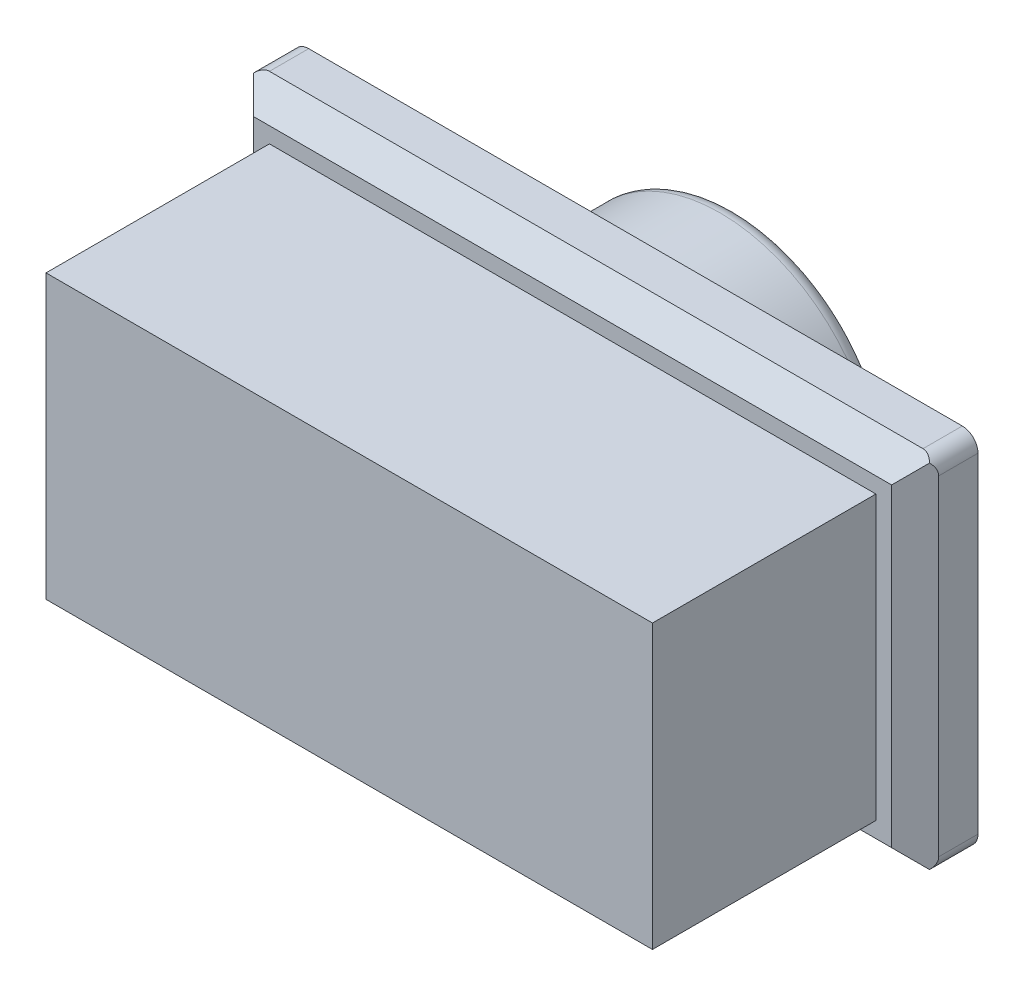
ISO-10303-21;
HEADER;
FILE_DESCRIPTION(('STEP AP214'),'2;1');
FILE_NAME('part.step','',(''),(''),'','','');
FILE_SCHEMA(('AUTOMOTIVE_DESIGN { 1 0 10303 214 1 1 1 1 }'));
ENDSEC;
DATA;
#1=APPLICATION_CONTEXT('core data for automotive mechanical design processes');
#2=APPLICATION_PROTOCOL_DEFINITION('international standard','automotive_design',2000,#1);
#3=PRODUCT_CONTEXT('',#1,'mechanical');
#4=PRODUCT('Part','Part','',(#3));
#5=PRODUCT_RELATED_PRODUCT_CATEGORY('part','',(#4));
#6=PRODUCT_DEFINITION_FORMATION('','',#4);
#7=PRODUCT_DEFINITION_CONTEXT('part definition',#1,'design');
#8=PRODUCT_DEFINITION('design','',#6,#7);
#9=PRODUCT_DEFINITION_SHAPE('','',#8);
#10=(LENGTH_UNIT() NAMED_UNIT(*) SI_UNIT(.MILLI.,.METRE.));
#11=(NAMED_UNIT(*) PLANE_ANGLE_UNIT() SI_UNIT($,.RADIAN.));
#12=(NAMED_UNIT(*) SI_UNIT($,.STERADIAN.) SOLID_ANGLE_UNIT());
#13=UNCERTAINTY_MEASURE_WITH_UNIT(LENGTH_MEASURE(1.E-05),#10,'distance_accuracy_value','');
#14=(GEOMETRIC_REPRESENTATION_CONTEXT(3) GLOBAL_UNCERTAINTY_ASSIGNED_CONTEXT((#13)) GLOBAL_UNIT_ASSIGNED_CONTEXT((#10,
#11,#12)) REPRESENTATION_CONTEXT('',''));
#15=CARTESIAN_POINT('',(0.,0.,0.));
#16=DIRECTION('',(0.,0.,1.));
#17=DIRECTION('',(1.,0.,0.));
#18=AXIS2_PLACEMENT_3D('',#15,#16,#17);
#19=CARTESIAN_POINT('',(-4.826,2.25,3.556));
#20=DIRECTION('',(1.,0.,0.));
#21=DIRECTION('',(0.,0.,-1.));
#22=AXIS2_PLACEMENT_3D('',#19,#20,#21);
#23=PLANE('',#22);
#24=DIRECTION('',(0.,-1.,0.));
#25=VECTOR('',#24,1.);
#26=CARTESIAN_POINT('',(-4.826,2.25,0.));
#27=LINE('',#26,#25);
#28=CARTESIAN_POINT('',(-4.826,2.25,0.));
#29=VERTEX_POINT('',#28);
#30=CARTESIAN_POINT('',(-4.826,-2.25,0.));
#31=VERTEX_POINT('',#30);
#32=EDGE_CURVE('E154',#29,#31,#27,.T.);
#33=ORIENTED_EDGE('',*,*,#32,.T.);
#34=DIRECTION('',(0.,0.,-1.));
#35=VECTOR('',#34,1.);
#36=CARTESIAN_POINT('',(-4.826,-2.25,3.556));
#37=LINE('',#36,#35);
#38=CARTESIAN_POINT('',(-4.826,-2.25,3.556));
#39=VERTEX_POINT('',#38);
#40=EDGE_CURVE('E176',#39,#31,#37,.T.);
#41=ORIENTED_EDGE('',*,*,#40,.F.);
#42=DIRECTION('',(0.,-1.,0.));
#43=VECTOR('',#42,1.);
#44=CARTESIAN_POINT('',(-4.826,2.25,3.556));
#45=LINE('',#44,#43);
#46=CARTESIAN_POINT('',(-4.826,2.25,3.556));
#47=VERTEX_POINT('',#46);
#48=EDGE_CURVE('E159',#47,#39,#45,.T.);
#49=ORIENTED_EDGE('',*,*,#48,.F.);
#50=DIRECTION('',(0.,0.,-1.));
#51=VECTOR('',#50,1.);
#52=CARTESIAN_POINT('',(-4.826,2.25,3.556));
#53=LINE('',#52,#51);
#54=EDGE_CURVE('E174',#47,#29,#53,.T.);
#55=ORIENTED_EDGE('',*,*,#54,.T.);
#56=EDGE_LOOP('',(#33,#41,#49,#55));
#57=FACE_BOUND('',#56,.T.);
#58=ADVANCED_FACE('F33',(#57),#23,.F.);
#59=CARTESIAN_POINT('',(-4.826,-2.25,3.556));
#60=DIRECTION('',(0.,1.,0.));
#61=DIRECTION('',(0.,0.,1.));
#62=AXIS2_PLACEMENT_3D('',#59,#60,#61);
#63=PLANE('',#62);
#64=DIRECTION('',(1.,0.,0.));
#65=VECTOR('',#64,1.);
#66=CARTESIAN_POINT('',(-4.826,-2.25,0.));
#67=LINE('',#66,#65);
#68=CARTESIAN_POINT('',(4.826,-2.25,0.));
#69=VERTEX_POINT('',#68);
#70=EDGE_CURVE('E170',#31,#69,#67,.T.);
#71=ORIENTED_EDGE('',*,*,#70,.T.);
#72=DIRECTION('',(0.,0.,-1.));
#73=VECTOR('',#72,1.);
#74=CARTESIAN_POINT('',(4.826,-2.25,3.556));
#75=LINE('',#74,#73);
#76=CARTESIAN_POINT('',(4.826,-2.25,3.556));
#77=VERTEX_POINT('',#76);
#78=EDGE_CURVE('E169',#77,#69,#75,.T.);
#79=ORIENTED_EDGE('',*,*,#78,.F.);
#80=DIRECTION('',(1.,0.,0.));
#81=VECTOR('',#80,1.);
#82=CARTESIAN_POINT('',(-4.826,-2.25,3.556));
#83=LINE('',#82,#81);
#84=EDGE_CURVE('E330',#39,#77,#83,.T.);
#85=ORIENTED_EDGE('',*,*,#84,.F.);
#86=ORIENTED_EDGE('',*,*,#40,.T.);
#87=EDGE_LOOP('',(#71,#79,#85,#86));
#88=FACE_BOUND('',#87,.T.);
#89=ADVANCED_FACE('F268',(#88),#63,.F.);
#90=CARTESIAN_POINT('',(4.826,2.25,3.556));
#91=DIRECTION('',(-1.,0.,0.));
#92=DIRECTION('',(0.,0.,1.));
#93=AXIS2_PLACEMENT_3D('',#90,#91,#92);
#94=PLANE('',#93);
#95=DIRECTION('',(0.,1.,0.));
#96=VECTOR('',#95,1.);
#97=CARTESIAN_POINT('',(4.826,2.25,0.));
#98=LINE('',#97,#96);
#99=CARTESIAN_POINT('',(4.826,2.25,0.));
#100=VERTEX_POINT('',#99);
#101=EDGE_CURVE('E151',#69,#100,#98,.T.);
#102=ORIENTED_EDGE('',*,*,#101,.T.);
#103=DIRECTION('',(0.,0.,-1.));
#104=VECTOR('',#103,1.);
#105=CARTESIAN_POINT('',(4.826,2.25,3.556));
#106=LINE('',#105,#104);
#107=CARTESIAN_POINT('',(4.826,2.25,3.556));
#108=VERTEX_POINT('',#107);
#109=EDGE_CURVE('E166',#108,#100,#106,.T.);
#110=ORIENTED_EDGE('',*,*,#109,.F.);
#111=DIRECTION('',(0.,1.,0.));
#112=VECTOR('',#111,1.);
#113=CARTESIAN_POINT('',(4.826,2.25,3.556));
#114=LINE('',#113,#112);
#115=EDGE_CURVE('E332',#77,#108,#114,.T.);
#116=ORIENTED_EDGE('',*,*,#115,.F.);
#117=ORIENTED_EDGE('',*,*,#78,.T.);
#118=EDGE_LOOP('',(#102,#110,#116,#117));
#119=FACE_BOUND('',#118,.T.);
#120=ADVANCED_FACE('F164',(#119),#94,.F.);
#121=CARTESIAN_POINT('',(-4.826,2.25,3.556));
#122=DIRECTION('',(0.,-1.,0.));
#123=DIRECTION('',(0.,0.,-1.));
#124=AXIS2_PLACEMENT_3D('',#121,#122,#123);
#125=PLANE('',#124);
#126=DIRECTION('',(-1.,0.,0.));
#127=VECTOR('',#126,1.);
#128=CARTESIAN_POINT('',(-4.826,2.25,0.));
#129=LINE('',#128,#127);
#130=EDGE_CURVE('E148',#100,#29,#129,.T.);
#131=ORIENTED_EDGE('',*,*,#130,.T.);
#132=ORIENTED_EDGE('',*,*,#54,.F.);
#133=DIRECTION('',(-1.,0.,0.));
#134=VECTOR('',#133,1.);
#135=CARTESIAN_POINT('',(-4.826,2.25,3.556));
#136=LINE('',#135,#134);
#137=EDGE_CURVE('E173',#108,#47,#136,.T.);
#138=ORIENTED_EDGE('',*,*,#137,.F.);
#139=ORIENTED_EDGE('',*,*,#109,.T.);
#140=EDGE_LOOP('',(#131,#132,#138,#139));
#141=FACE_BOUND('',#140,.T.);
#142=ADVANCED_FACE('F172',(#141),#125,.F.);
#143=CARTESIAN_POINT('',(0.,0.,3.556));
#144=DIRECTION('',(0.,0.,1.));
#145=DIRECTION('',(1.,0.,0.));
#146=AXIS2_PLACEMENT_3D('',#143,#144,#145);
#147=PLANE('',#146);
#148=ORIENTED_EDGE('',*,*,#48,.T.);
#149=ORIENTED_EDGE('',*,*,#84,.T.);
#150=ORIENTED_EDGE('',*,*,#115,.T.);
#151=ORIENTED_EDGE('',*,*,#137,.T.);
#152=EDGE_LOOP('',(#148,#149,#150,#151));
#153=FACE_BOUND('',#152,.T.);
#154=ADVANCED_FACE('F338',(#153),#147,.T.);
#155=CARTESIAN_POINT('',(0.,0.,0.));
#156=DIRECTION('',(0.,0.,-1.));
#157=DIRECTION('',(-1.,0.,0.));
#158=AXIS2_PLACEMENT_3D('',#155,#156,#157);
#159=PLANE('',#158);
#160=DIRECTION('',(0.,-1.,0.));
#161=VECTOR('',#160,1.);
#162=CARTESIAN_POINT('',(-5.0760178,0.,0.));
#163=LINE('',#162,#161);
#164=CARTESIAN_POINT('',(-5.0760178,2.5000178,0.));
#165=VERTEX_POINT('',#164);
#166=CARTESIAN_POINT('',(-5.0760178,-2.5000178,0.));
#167=VERTEX_POINT('',#166);
#168=EDGE_CURVE('E190',#165,#167,#163,.T.);
#169=ORIENTED_EDGE('',*,*,#168,.T.);
#170=DIRECTION('',(1.,0.,0.));
#171=VECTOR('',#170,1.);
#172=CARTESIAN_POINT('',(0.,-2.5000178,0.));
#173=LINE('',#172,#171);
#174=CARTESIAN_POINT('',(5.0760178,-2.5000178,0.));
#175=VERTEX_POINT('',#174);
#176=EDGE_CURVE('E192',#167,#175,#173,.T.);
#177=ORIENTED_EDGE('',*,*,#176,.T.);
#178=DIRECTION('',(0.,1.,0.));
#179=VECTOR('',#178,1.);
#180=CARTESIAN_POINT('',(5.0760178,0.,0.));
#181=LINE('',#180,#179);
#182=CARTESIAN_POINT('',(5.0760178,2.5000178,0.));
#183=VERTEX_POINT('',#182);
#184=EDGE_CURVE('E185',#175,#183,#181,.T.);
#185=ORIENTED_EDGE('',*,*,#184,.T.);
#186=DIRECTION('',(-1.,0.,0.));
#187=VECTOR('',#186,1.);
#188=CARTESIAN_POINT('',(0.,2.5000178,0.));
#189=LINE('',#188,#187);
#190=EDGE_CURVE('E188',#183,#165,#189,.T.);
#191=ORIENTED_EDGE('',*,*,#190,.T.);
#192=EDGE_LOOP('',(#169,#177,#185,#191));
#193=FACE_BOUND('',#192,.T.);
#194=ORIENTED_EDGE('',*,*,#70,.F.);
#195=ORIENTED_EDGE('',*,*,#32,.F.);
#196=ORIENTED_EDGE('',*,*,#130,.F.);
#197=ORIENTED_EDGE('',*,*,#101,.F.);
#198=EDGE_LOOP('',(#194,#195,#196,#197));
#199=FACE_BOUND('',#198,.T.);
#200=ADVANCED_FACE('F150',(#193,#199),#159,.F.);
#201=CARTESIAN_POINT('',(5.4510178,-2.8750178,-1.));
#202=DIRECTION('',(0.,1.,0.));
#203=DIRECTION('',(0.,0.,1.));
#204=AXIS2_PLACEMENT_3D('',#201,#202,#203);
#205=PLANE('',#204);
#206=DIRECTION('',(-1.,0.,0.));
#207=VECTOR('',#206,1.);
#208=CARTESIAN_POINT('',(5.4510178,-2.8750178,-0.375000000000002));
#209=LINE('',#208,#207);
#210=CARTESIAN_POINT('',(5.2010178,-2.8750178,-0.375000000000002));
#211=VERTEX_POINT('',#210);
#212=CARTESIAN_POINT('',(-5.2010178,-2.8750178,-0.375000000000002));
#213=VERTEX_POINT('',#212);
#214=EDGE_CURVE('E182',#211,#213,#209,.T.);
#215=ORIENTED_EDGE('',*,*,#214,.T.);
#216=DIRECTION('',(0.,0.,1.));
#217=VECTOR('',#216,1.);
#218=CARTESIAN_POINT('',(-5.2010178,-2.8750178,-1.));
#219=LINE('',#218,#217);
#220=CARTESIAN_POINT('',(-5.2010178,-2.8750178,-1.));
#221=VERTEX_POINT('',#220);
#222=EDGE_CURVE('E230',#213,#221,#219,.F.);
#223=ORIENTED_EDGE('',*,*,#222,.T.);
#224=DIRECTION('',(-1.,0.,0.));
#225=VECTOR('',#224,1.);
#226=CARTESIAN_POINT('',(5.4510178,-2.8750178,-1.));
#227=LINE('',#226,#225);
#228=CARTESIAN_POINT('',(5.2010178,-2.8750178,-1.));
#229=VERTEX_POINT('',#228);
#230=EDGE_CURVE('E486',#229,#221,#227,.T.);
#231=ORIENTED_EDGE('',*,*,#230,.F.);
#232=DIRECTION('',(0.,0.,1.));
#233=VECTOR('',#232,1.);
#234=CARTESIAN_POINT('',(5.2010178,-2.8750178,-1.));
#235=LINE('',#234,#233);
#236=EDGE_CURVE('E227',#229,#211,#235,.T.);
#237=ORIENTED_EDGE('',*,*,#236,.T.);
#238=EDGE_LOOP('',(#215,#223,#231,#237));
#239=FACE_BOUND('',#238,.T.);
#240=ADVANCED_FACE('F345',(#239),#205,.F.);
#241=CARTESIAN_POINT('',(-5.4510178,-2.8750178,-1.));
#242=DIRECTION('',(1.,0.,0.));
#243=DIRECTION('',(0.,0.,-1.));
#244=AXIS2_PLACEMENT_3D('',#241,#242,#243);
#245=PLANE('',#244);
#246=DIRECTION('',(0.,1.,0.));
#247=VECTOR('',#246,1.);
#248=CARTESIAN_POINT('',(-5.4510178,-2.8750178,-1.));
#249=LINE('',#248,#247);
#250=CARTESIAN_POINT('',(-5.4510178,-2.6250178,-1.));
#251=VERTEX_POINT('',#250);
#252=CARTESIAN_POINT('',(-5.4510178,2.6250178,-1.));
#253=VERTEX_POINT('',#252);
#254=EDGE_CURVE('E324',#251,#253,#249,.T.);
#255=ORIENTED_EDGE('',*,*,#254,.F.);
#256=DIRECTION('',(0.,0.,1.));
#257=VECTOR('',#256,1.);
#258=CARTESIAN_POINT('',(-5.4510178,-2.6250178,-1.));
#259=LINE('',#258,#257);
#260=CARTESIAN_POINT('',(-5.4510178,-2.6250178,-0.375000000000002));
#261=VERTEX_POINT('',#260);
#262=EDGE_CURVE('E216',#251,#261,#259,.T.);
#263=ORIENTED_EDGE('',*,*,#262,.T.);
#264=DIRECTION('',(0.,1.,0.));
#265=VECTOR('',#264,1.);
#266=CARTESIAN_POINT('',(-5.4510178,-2.8750178,-0.375000000000002));
#267=LINE('',#266,#265);
#268=CARTESIAN_POINT('',(-5.4510178,2.6250178,-0.375000000000002));
#269=VERTEX_POINT('',#268);
#270=EDGE_CURVE('E195',#261,#269,#267,.T.);
#271=ORIENTED_EDGE('',*,*,#270,.T.);
#272=DIRECTION('',(0.,0.,1.));
#273=VECTOR('',#272,1.);
#274=CARTESIAN_POINT('',(-5.4510178,2.6250178,-1.));
#275=LINE('',#274,#273);
#276=EDGE_CURVE('E203',#269,#253,#275,.F.);
#277=ORIENTED_EDGE('',*,*,#276,.T.);
#278=EDGE_LOOP('',(#255,#263,#271,#277));
#279=FACE_BOUND('',#278,.T.);
#280=ADVANCED_FACE('F376',(#279),#245,.F.);
#281=CARTESIAN_POINT('',(-5.4510178,2.8750178,-1.));
#282=DIRECTION('',(0.,-1.,0.));
#283=DIRECTION('',(0.,0.,-1.));
#284=AXIS2_PLACEMENT_3D('',#281,#282,#283);
#285=PLANE('',#284);
#286=DIRECTION('',(1.,0.,0.));
#287=VECTOR('',#286,1.);
#288=CARTESIAN_POINT('',(-5.4510178,2.8750178,-0.375000000000002));
#289=LINE('',#288,#287);
#290=CARTESIAN_POINT('',(-5.2010178,2.8750178,-0.375000000000002));
#291=VERTEX_POINT('',#290);
#292=CARTESIAN_POINT('',(5.2010178,2.8750178,-0.375000000000002));
#293=VERTEX_POINT('',#292);
#294=EDGE_CURVE('E198',#291,#293,#289,.T.);
#295=ORIENTED_EDGE('',*,*,#294,.T.);
#296=DIRECTION('',(0.,0.,1.));
#297=VECTOR('',#296,1.);
#298=CARTESIAN_POINT('',(5.2010178,2.8750178,-1.));
#299=LINE('',#298,#297);
#300=CARTESIAN_POINT('',(5.2010178,2.8750178,-1.));
#301=VERTEX_POINT('',#300);
#302=EDGE_CURVE('E253',#293,#301,#299,.F.);
#303=ORIENTED_EDGE('',*,*,#302,.T.);
#304=DIRECTION('',(1.,0.,0.));
#305=VECTOR('',#304,1.);
#306=CARTESIAN_POINT('',(-5.4510178,2.8750178,-1.));
#307=LINE('',#306,#305);
#308=CARTESIAN_POINT('',(-5.2010178,2.8750178,-1.));
#309=VERTEX_POINT('',#308);
#310=EDGE_CURVE('E317',#309,#301,#307,.T.);
#311=ORIENTED_EDGE('',*,*,#310,.F.);
#312=DIRECTION('',(0.,0.,1.));
#313=VECTOR('',#312,1.);
#314=CARTESIAN_POINT('',(-5.2010178,2.8750178,-1.));
#315=LINE('',#314,#313);
#316=EDGE_CURVE('E251',#309,#291,#315,.T.);
#317=ORIENTED_EDGE('',*,*,#316,.T.);
#318=EDGE_LOOP('',(#295,#303,#311,#317));
#319=FACE_BOUND('',#318,.T.);
#320=ADVANCED_FACE('F385',(#319),#285,.F.);
#321=CARTESIAN_POINT('',(5.4510178,2.8750178,-1.));
#322=DIRECTION('',(-1.,0.,0.));
#323=DIRECTION('',(0.,0.,1.));
#324=AXIS2_PLACEMENT_3D('',#321,#322,#323);
#325=PLANE('',#324);
#326=DIRECTION('',(0.,-1.,0.));
#327=VECTOR('',#326,1.);
#328=CARTESIAN_POINT('',(5.4510178,2.8750178,-0.375000000000002));
#329=LINE('',#328,#327);
#330=CARTESIAN_POINT('',(5.4510178,2.6250178,-0.375000000000002));
#331=VERTEX_POINT('',#330);
#332=CARTESIAN_POINT('',(5.4510178,-2.6250178,-0.375000000000002));
#333=VERTEX_POINT('',#332);
#334=EDGE_CURVE('E200',#331,#333,#329,.T.);
#335=ORIENTED_EDGE('',*,*,#334,.T.);
#336=DIRECTION('',(0.,0.,1.));
#337=VECTOR('',#336,1.);
#338=CARTESIAN_POINT('',(5.4510178,-2.6250178,-1.));
#339=LINE('',#338,#337);
#340=CARTESIAN_POINT('',(5.4510178,-2.6250178,-1.));
#341=VERTEX_POINT('',#340);
#342=EDGE_CURVE('E247',#333,#341,#339,.F.);
#343=ORIENTED_EDGE('',*,*,#342,.T.);
#344=DIRECTION('',(0.,-1.,0.));
#345=VECTOR('',#344,1.);
#346=CARTESIAN_POINT('',(5.4510178,2.8750178,-1.));
#347=LINE('',#346,#345);
#348=CARTESIAN_POINT('',(5.4510178,2.6250178,-1.));
#349=VERTEX_POINT('',#348);
#350=EDGE_CURVE('E314',#349,#341,#347,.T.);
#351=ORIENTED_EDGE('',*,*,#350,.F.);
#352=DIRECTION('',(0.,0.,1.));
#353=VECTOR('',#352,1.);
#354=CARTESIAN_POINT('',(5.4510178,2.6250178,-1.));
#355=LINE('',#354,#353);
#356=EDGE_CURVE('E244',#349,#331,#355,.T.);
#357=ORIENTED_EDGE('',*,*,#356,.T.);
#358=EDGE_LOOP('',(#335,#343,#351,#357));
#359=FACE_BOUND('',#358,.T.);
#360=ADVANCED_FACE('F319',(#359),#325,.F.);
#361=CARTESIAN_POINT('',(0.,0.,-1.));
#362=DIRECTION('',(0.,0.,-1.));
#363=DIRECTION('',(-1.,0.,0.));
#364=AXIS2_PLACEMENT_3D('',#361,#362,#363);
#365=PLANE('',#364);
#366=CARTESIAN_POINT('',(0.,0.,-1.));
#367=DIRECTION('',(0.,0.,-1.));
#368=DIRECTION('',(-1.,0.,0.));
#369=AXIS2_PLACEMENT_3D('',#366,#367,#368);
#370=CIRCLE('',#369,2.54);
#371=CARTESIAN_POINT('',(-2.54,0.,-1.));
#372=VERTEX_POINT('',#371);
#373=EDGE_CURVE('E214',#372,#372,#370,.T.);
#374=ORIENTED_EDGE('',*,*,#373,.F.);
#375=EDGE_LOOP('',(#374));
#376=FACE_BOUND('',#375,.T.);
#377=ORIENTED_EDGE('',*,*,#230,.T.);
#378=CARTESIAN_POINT('',(-5.2010178,-2.6250178,-1.));
#379=DIRECTION('',(0.,0.,-1.));
#380=DIRECTION('',(-1.,0.,0.));
#381=AXIS2_PLACEMENT_3D('',#378,#379,#380);
#382=CIRCLE('',#381,0.25);
#383=EDGE_CURVE('E238',#221,#251,#382,.T.);
#384=ORIENTED_EDGE('',*,*,#383,.T.);
#385=ORIENTED_EDGE('',*,*,#254,.T.);
#386=CARTESIAN_POINT('',(-5.2010178,2.6250178,-1.));
#387=DIRECTION('',(0.,0.,-1.));
#388=DIRECTION('',(-1.,0.,0.));
#389=AXIS2_PLACEMENT_3D('',#386,#387,#388);
#390=CIRCLE('',#389,0.25);
#391=EDGE_CURVE('E232',#253,#309,#390,.T.);
#392=ORIENTED_EDGE('',*,*,#391,.T.);
#393=ORIENTED_EDGE('',*,*,#310,.T.);
#394=CARTESIAN_POINT('',(5.2010178,2.6250178,-1.));
#395=DIRECTION('',(0.,0.,-1.));
#396=DIRECTION('',(-1.,0.,0.));
#397=AXIS2_PLACEMENT_3D('',#394,#395,#396);
#398=CIRCLE('',#397,0.25);
#399=EDGE_CURVE('E234',#301,#349,#398,.T.);
#400=ORIENTED_EDGE('',*,*,#399,.T.);
#401=ORIENTED_EDGE('',*,*,#350,.T.);
#402=CARTESIAN_POINT('',(5.2010178,-2.6250178,-1.));
#403=DIRECTION('',(0.,0.,-1.));
#404=DIRECTION('',(-1.,0.,0.));
#405=AXIS2_PLACEMENT_3D('',#402,#403,#404);
#406=CIRCLE('',#405,0.25);
#407=EDGE_CURVE('E236',#341,#229,#406,.T.);
#408=ORIENTED_EDGE('',*,*,#407,.T.);
#409=EDGE_LOOP('',(#377,#384,#385,#392,#393,#400,#401,#408));
#410=FACE_BOUND('',#409,.T.);
#411=ADVANCED_FACE('F313',(#376,#410),#365,.T.);
#412=CARTESIAN_POINT('',(0.,0.,-2.6002));
#413=DIRECTION('',(0.,0.,1.));
#414=DIRECTION('',(1.,0.,0.));
#415=AXIS2_PLACEMENT_3D('',#412,#413,#414);
#416=CYLINDRICAL_SURFACE('',#415,2.54);
#417=CARTESIAN_POINT('',(0.,0.,-2.3462));
#418=DIRECTION('',(0.,0.,-1.));
#419=DIRECTION('',(-1.,0.,0.));
#420=AXIS2_PLACEMENT_3D('',#417,#418,#419);
#421=CIRCLE('',#420,2.54);
#422=CARTESIAN_POINT('',(-2.54,0.,-2.3462));
#423=VERTEX_POINT('',#422);
#424=EDGE_CURVE('E11',#423,#423,#421,.F.);
#425=ORIENTED_EDGE('',*,*,#424,.T.);
#426=EDGE_LOOP('',(#425));
#427=FACE_BOUND('',#426,.T.);
#428=ORIENTED_EDGE('',*,*,#373,.T.);
#429=EDGE_LOOP('',(#428));
#430=FACE_BOUND('',#429,.T.);
#431=ADVANCED_FACE('F411',(#427,#430),#416,.T.);
#432=CARTESIAN_POINT('',(0.,0.,-2.6002));
#433=DIRECTION('',(0.,0.,-1.));
#434=DIRECTION('',(-1.,0.,0.));
#435=AXIS2_PLACEMENT_3D('',#432,#433,#434);
#436=PLANE('',#435);
#437=CARTESIAN_POINT('',(0.,0.,-2.6002));
#438=DIRECTION('',(0.,0.,-1.));
#439=DIRECTION('',(-1.,0.,0.));
#440=AXIS2_PLACEMENT_3D('',#437,#438,#439);
#441=CIRCLE('',#440,2.286);
#442=CARTESIAN_POINT('',(-2.286,0.,-2.6002));
#443=VERTEX_POINT('',#442);
#444=EDGE_CURVE('E41',#443,#443,#441,.T.);
#445=ORIENTED_EDGE('',*,*,#444,.T.);
#446=EDGE_LOOP('',(#445));
#447=FACE_BOUND('',#446,.T.);
#448=ADVANCED_FACE('F257',(#447),#436,.T.);
#449=CARTESIAN_POINT('',(-5.4510178,2.8750178,-0.375000000000002));
#450=DIRECTION('',(0.,-0.707106781186546,-0.707106781186549));
#451=DIRECTION('',(1.,0.,0.));
#452=AXIS2_PLACEMENT_3D('',#449,#450,#451);
#453=PLANE('',#452);
#454=DIRECTION('',(-0.577350269189627,-0.577350269189627,0.577350269189624));
#455=VECTOR('',#454,1.);
#456=CARTESIAN_POINT('',(5.4510178,2.8750178,-0.375000000000002));
#457=LINE('',#456,#455);
#458=CARTESIAN_POINT('',(5.37779449529664,2.80179449529664,-0.301776695296639));
#459=VERTEX_POINT('',#458);
#460=EDGE_CURVE('E212',#459,#183,#457,.T.);
#461=ORIENTED_EDGE('',*,*,#460,.F.);
#462=CARTESIAN_POINT('',(5.2010178,2.6250178,-0.125000000000003));
#463=DIRECTION('',(0.,-0.707106781186546,-0.707106781186549));
#464=DIRECTION('',(0.,-0.707106781186549,0.707106781186546));
#465=AXIS2_PLACEMENT_3D('',#462,#463,#464);
#466=ELLIPSE('',#465,0.353553390593273,0.25);
#467=EDGE_CURVE('E48',#459,#293,#466,.F.);
#468=ORIENTED_EDGE('',*,*,#467,.T.);
#469=ORIENTED_EDGE('',*,*,#294,.F.);
#470=CARTESIAN_POINT('',(-5.2010178,2.6250178,-0.125000000000003));
#471=DIRECTION('',(0.,-0.707106781186546,-0.707106781186549));
#472=DIRECTION('',(0.,-0.707106781186549,0.707106781186546));
#473=AXIS2_PLACEMENT_3D('',#470,#471,#472);
#474=ELLIPSE('',#473,0.353553390593273,0.25);
#475=CARTESIAN_POINT('',(-5.37779449529664,2.80179449529664,-0.301776695296639));
#476=VERTEX_POINT('',#475);
#477=EDGE_CURVE('E56',#291,#476,#474,.F.);
#478=ORIENTED_EDGE('',*,*,#477,.T.);
#479=DIRECTION('',(0.577350269189627,-0.577350269189627,0.577350269189624));
#480=VECTOR('',#479,1.);
#481=CARTESIAN_POINT('',(-5.4510178,2.8750178,-0.375000000000002));
#482=LINE('',#481,#480);
#483=EDGE_CURVE('E209',#165,#476,#482,.F.);
#484=ORIENTED_EDGE('',*,*,#483,.F.);
#485=ORIENTED_EDGE('',*,*,#190,.F.);
#486=EDGE_LOOP('',(#461,#468,#469,#478,#484,#485));
#487=FACE_BOUND('',#486,.T.);
#488=ADVANCED_FACE('F290',(#487),#453,.F.);
#489=CARTESIAN_POINT('',(5.4510178,2.8750178,-0.375000000000002));
#490=DIRECTION('',(-0.707106781186546,0.,-0.707106781186549));
#491=DIRECTION('',(0.,-1.,0.));
#492=AXIS2_PLACEMENT_3D('',#489,#490,#491);
#493=PLANE('',#492);
#494=DIRECTION('',(0.577350269189627,-0.577350269189627,-0.577350269189624));
#495=VECTOR('',#494,1.);
#496=CARTESIAN_POINT('',(3.53433926666666,-0.958339266666661,1.54167853333333));
#497=LINE('',#496,#495);
#498=CARTESIAN_POINT('',(5.37779449529664,-2.80179449529664,-0.301776695296639));
#499=VERTEX_POINT('',#498);
#500=EDGE_CURVE('E207',#499,#175,#497,.F.);
#501=ORIENTED_EDGE('',*,*,#500,.F.);
#502=CARTESIAN_POINT('',(5.2010178,-2.6250178,-0.125000000000003));
#503=DIRECTION('',(-0.707106781186546,0.,-0.707106781186549));
#504=DIRECTION('',(-0.707106781186549,0.,0.707106781186546));
#505=AXIS2_PLACEMENT_3D('',#502,#503,#504);
#506=ELLIPSE('',#505,0.353553390593273,0.25);
#507=EDGE_CURVE('E242',#499,#333,#506,.F.);
#508=ORIENTED_EDGE('',*,*,#507,.T.);
#509=ORIENTED_EDGE('',*,*,#334,.F.);
#510=CARTESIAN_POINT('',(5.2010178,2.6250178,-0.125000000000003));
#511=DIRECTION('',(-0.707106781186546,0.,-0.707106781186549));
#512=DIRECTION('',(-0.707106781186549,0.,0.707106781186546));
#513=AXIS2_PLACEMENT_3D('',#510,#511,#512);
#514=ELLIPSE('',#513,0.353553390593273,0.25);
#515=EDGE_CURVE('E240',#331,#459,#514,.F.);
#516=ORIENTED_EDGE('',*,*,#515,.T.);
#517=ORIENTED_EDGE('',*,*,#460,.T.);
#518=ORIENTED_EDGE('',*,*,#184,.F.);
#519=EDGE_LOOP('',(#501,#508,#509,#516,#517,#518));
#520=FACE_BOUND('',#519,.T.);
#521=ADVANCED_FACE('F286',(#520),#493,.F.);
#522=CARTESIAN_POINT('',(-5.4510178,-2.8750178,-0.375000000000002));
#523=DIRECTION('',(0.707106781186546,0.,-0.707106781186549));
#524=DIRECTION('',(0.,1.,0.));
#525=AXIS2_PLACEMENT_3D('',#522,#523,#524);
#526=PLANE('',#525);
#527=ORIENTED_EDGE('',*,*,#270,.F.);
#528=CARTESIAN_POINT('',(-5.2010178,-2.6250178,-0.125000000000003));
#529=DIRECTION('',(0.707106781186546,0.,-0.707106781186549));
#530=DIRECTION('',(0.707106781186549,0.,0.707106781186546));
#531=AXIS2_PLACEMENT_3D('',#528,#529,#530);
#532=ELLIPSE('',#531,0.353553390593273,0.25);
#533=CARTESIAN_POINT('',(-5.37779449529664,-2.80179449529664,-0.301776695296639));
#534=VERTEX_POINT('',#533);
#535=EDGE_CURVE('E221',#261,#534,#532,.F.);
#536=ORIENTED_EDGE('',*,*,#535,.T.);
#537=DIRECTION('',(0.577350269189627,0.577350269189627,0.577350269189624));
#538=VECTOR('',#537,1.);
#539=CARTESIAN_POINT('',(-5.4510178,-2.8750178,-0.375000000000002));
#540=LINE('',#539,#538);
#541=EDGE_CURVE('E204',#167,#534,#540,.F.);
#542=ORIENTED_EDGE('',*,*,#541,.F.);
#543=ORIENTED_EDGE('',*,*,#168,.F.);
#544=ORIENTED_EDGE('',*,*,#483,.T.);
#545=CARTESIAN_POINT('',(-5.2010178,2.6250178,-0.125000000000003));
#546=DIRECTION('',(0.707106781186546,0.,-0.707106781186549));
#547=DIRECTION('',(0.707106781186549,0.,0.707106781186546));
#548=AXIS2_PLACEMENT_3D('',#545,#546,#547);
#549=ELLIPSE('',#548,0.353553390593273,0.25);
#550=EDGE_CURVE('E219',#476,#269,#549,.F.);
#551=ORIENTED_EDGE('',*,*,#550,.T.);
#552=EDGE_LOOP('',(#527,#536,#542,#543,#544,#551));
#553=FACE_BOUND('',#552,.T.);
#554=ADVANCED_FACE('F282',(#553),#526,.F.);
#555=CARTESIAN_POINT('',(5.4510178,-2.8750178,-0.375000000000002));
#556=DIRECTION('',(0.,0.707106781186546,-0.707106781186549));
#557=DIRECTION('',(-1.,0.,0.));
#558=AXIS2_PLACEMENT_3D('',#555,#556,#557);
#559=PLANE('',#558);
#560=ORIENTED_EDGE('',*,*,#541,.T.);
#561=CARTESIAN_POINT('',(-5.2010178,-2.6250178,-0.125000000000003));
#562=DIRECTION('',(0.,0.707106781186546,-0.707106781186549));
#563=DIRECTION('',(0.,0.707106781186549,0.707106781186546));
#564=AXIS2_PLACEMENT_3D('',#561,#562,#563);
#565=ELLIPSE('',#564,0.353553390593273,0.25);
#566=EDGE_CURVE('E225',#534,#213,#565,.F.);
#567=ORIENTED_EDGE('',*,*,#566,.T.);
#568=ORIENTED_EDGE('',*,*,#214,.F.);
#569=CARTESIAN_POINT('',(5.2010178,-2.6250178,-0.125000000000003));
#570=DIRECTION('',(0.,0.707106781186546,-0.707106781186549));
#571=DIRECTION('',(0.,0.707106781186549,0.707106781186546));
#572=AXIS2_PLACEMENT_3D('',#569,#570,#571);
#573=ELLIPSE('',#572,0.353553390593273,0.25);
#574=EDGE_CURVE('E223',#211,#499,#573,.F.);
#575=ORIENTED_EDGE('',*,*,#574,.T.);
#576=ORIENTED_EDGE('',*,*,#500,.T.);
#577=ORIENTED_EDGE('',*,*,#176,.F.);
#578=EDGE_LOOP('',(#560,#567,#568,#575,#576,#577));
#579=FACE_BOUND('',#578,.T.);
#580=ADVANCED_FACE('F278',(#579),#559,.F.);
#581=CARTESIAN_POINT('',(-5.2010178,-2.6250178,-1.));
#582=DIRECTION('',(0.,0.,1.));
#583=DIRECTION('',(1.,0.,0.));
#584=AXIS2_PLACEMENT_3D('',#581,#582,#583);
#585=CYLINDRICAL_SURFACE('',#584,0.25);
#586=ORIENTED_EDGE('',*,*,#383,.F.);
#587=ORIENTED_EDGE('',*,*,#222,.F.);
#588=ORIENTED_EDGE('',*,*,#566,.F.);
#589=ORIENTED_EDGE('',*,*,#535,.F.);
#590=ORIENTED_EDGE('',*,*,#262,.F.);
#591=EDGE_LOOP('',(#586,#587,#588,#589,#590));
#592=FACE_BOUND('',#591,.T.);
#593=ADVANCED_FACE('F281',(#592),#585,.T.);
#594=CARTESIAN_POINT('',(5.2010178,-2.6250178,-1.));
#595=DIRECTION('',(0.,0.,1.));
#596=DIRECTION('',(1.,0.,0.));
#597=AXIS2_PLACEMENT_3D('',#594,#595,#596);
#598=CYLINDRICAL_SURFACE('',#597,0.25);
#599=ORIENTED_EDGE('',*,*,#407,.F.);
#600=ORIENTED_EDGE('',*,*,#342,.F.);
#601=ORIENTED_EDGE('',*,*,#507,.F.);
#602=ORIENTED_EDGE('',*,*,#574,.F.);
#603=ORIENTED_EDGE('',*,*,#236,.F.);
#604=EDGE_LOOP('',(#599,#600,#601,#602,#603));
#605=FACE_BOUND('',#604,.T.);
#606=ADVANCED_FACE('F296',(#605),#598,.T.);
#607=CARTESIAN_POINT('',(5.2010178,2.6250178,-1.));
#608=DIRECTION('',(0.,0.,1.));
#609=DIRECTION('',(1.,0.,0.));
#610=AXIS2_PLACEMENT_3D('',#607,#608,#609);
#611=CYLINDRICAL_SURFACE('',#610,0.25);
#612=ORIENTED_EDGE('',*,*,#399,.F.);
#613=ORIENTED_EDGE('',*,*,#302,.F.);
#614=ORIENTED_EDGE('',*,*,#467,.F.);
#615=ORIENTED_EDGE('',*,*,#515,.F.);
#616=ORIENTED_EDGE('',*,*,#356,.F.);
#617=EDGE_LOOP('',(#612,#613,#614,#615,#616));
#618=FACE_BOUND('',#617,.T.);
#619=ADVANCED_FACE('F265',(#618),#611,.T.);
#620=CARTESIAN_POINT('',(-5.2010178,2.6250178,-1.));
#621=DIRECTION('',(0.,0.,1.));
#622=DIRECTION('',(1.,0.,0.));
#623=AXIS2_PLACEMENT_3D('',#620,#621,#622);
#624=CYLINDRICAL_SURFACE('',#623,0.25);
#625=ORIENTED_EDGE('',*,*,#391,.F.);
#626=ORIENTED_EDGE('',*,*,#276,.F.);
#627=ORIENTED_EDGE('',*,*,#550,.F.);
#628=ORIENTED_EDGE('',*,*,#477,.F.);
#629=ORIENTED_EDGE('',*,*,#316,.F.);
#630=EDGE_LOOP('',(#625,#626,#627,#628,#629));
#631=FACE_BOUND('',#630,.T.);
#632=ADVANCED_FACE('F260',(#631),#624,.T.);
#633=CARTESIAN_POINT('',(0.,0.,-2.3462));
#634=DIRECTION('',(0.,0.,-1.));
#635=DIRECTION('',(-1.,0.,0.));
#636=AXIS2_PLACEMENT_3D('',#633,#634,#635);
#637=TOROIDAL_SURFACE('',#636,2.286,0.254);
#638=ORIENTED_EDGE('',*,*,#424,.F.);
#639=EDGE_LOOP('',(#638));
#640=FACE_BOUND('',#639,.T.);
#641=ORIENTED_EDGE('',*,*,#444,.F.);
#642=EDGE_LOOP('',(#641));
#643=FACE_BOUND('',#642,.T.);
#644=ADVANCED_FACE('F35',(#640,#643),#637,.T.);
#645=CLOSED_SHELL('',(#58,#89,#120,#142,#154,#200,#240,#280,#320,#360,#411,#431,#448,#488,#521,
#554,#580,#593,#606,#619,#632,#644));
#646=MANIFOLD_SOLID_BREP('B2',#645);
#647=ADVANCED_BREP_SHAPE_REPRESENTATION('',(#18,#646),#14);
#648=SHAPE_DEFINITION_REPRESENTATION(#9,#647);
ENDSEC;
END-ISO-10303-21;
